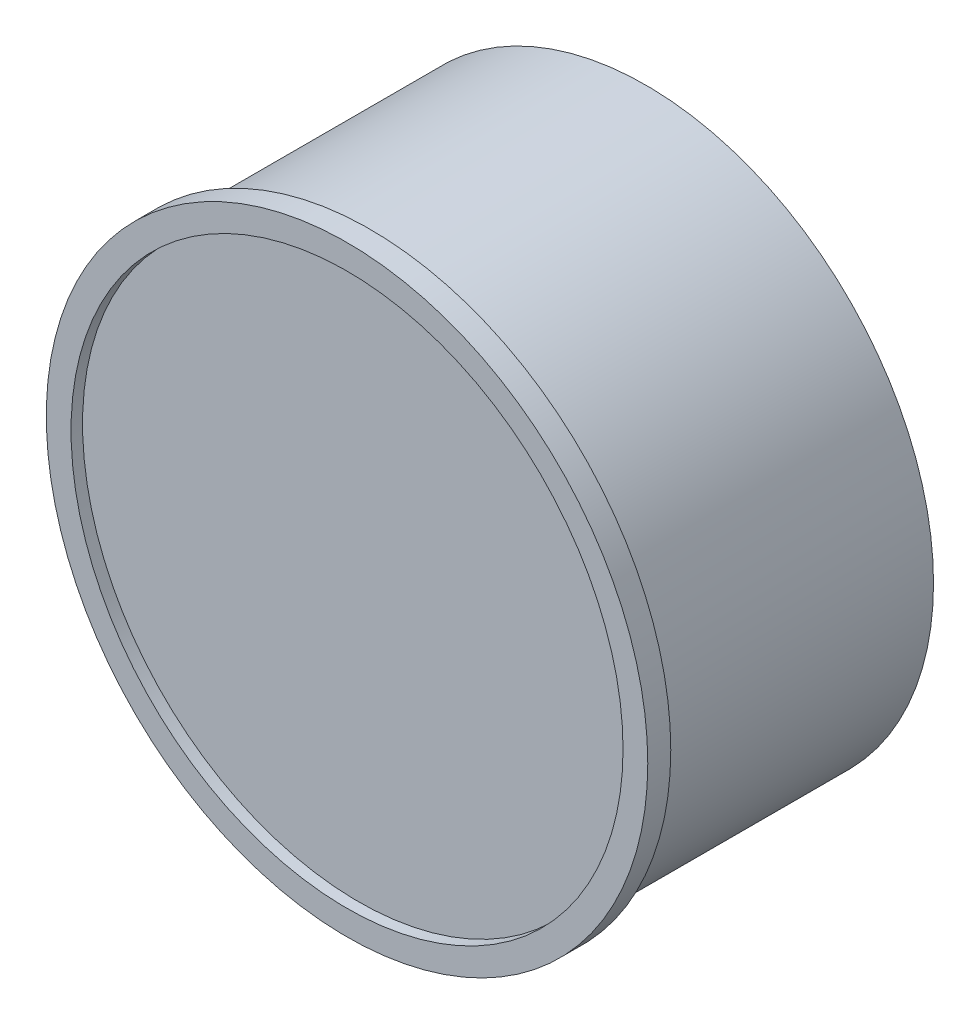
ISO-10303-21;
HEADER;
FILE_DESCRIPTION(('STEP AP214'),'2;1');
FILE_NAME('part.step','',(''),(''),'','','');
FILE_SCHEMA(('AUTOMOTIVE_DESIGN { 1 0 10303 214 1 1 1 1 }'));
ENDSEC;
DATA;
#1=APPLICATION_CONTEXT('core data for automotive mechanical design processes');
#2=APPLICATION_PROTOCOL_DEFINITION('international standard','automotive_design',2000,#1);
#3=PRODUCT_CONTEXT('',#1,'mechanical');
#4=PRODUCT('Part','Part','',(#3));
#5=PRODUCT_RELATED_PRODUCT_CATEGORY('part','',(#4));
#6=PRODUCT_DEFINITION_FORMATION('','',#4);
#7=PRODUCT_DEFINITION_CONTEXT('part definition',#1,'design');
#8=PRODUCT_DEFINITION('design','',#6,#7);
#9=PRODUCT_DEFINITION_SHAPE('','',#8);
#10=(LENGTH_UNIT() NAMED_UNIT(*) SI_UNIT(.MILLI.,.METRE.));
#11=(NAMED_UNIT(*) PLANE_ANGLE_UNIT() SI_UNIT($,.RADIAN.));
#12=(NAMED_UNIT(*) SI_UNIT($,.STERADIAN.) SOLID_ANGLE_UNIT());
#13=UNCERTAINTY_MEASURE_WITH_UNIT(LENGTH_MEASURE(1.E-05),#10,'distance_accuracy_value','');
#14=(GEOMETRIC_REPRESENTATION_CONTEXT(3) GLOBAL_UNCERTAINTY_ASSIGNED_CONTEXT((#13)) GLOBAL_UNIT_ASSIGNED_CONTEXT((#10,
#11,#12)) REPRESENTATION_CONTEXT('',''));
#15=CARTESIAN_POINT('',(0.,0.,0.));
#16=DIRECTION('',(0.,0.,1.));
#17=DIRECTION('',(1.,0.,0.));
#18=AXIS2_PLACEMENT_3D('',#15,#16,#17);
#19=CARTESIAN_POINT('',(0.,0.,0.));
#20=DIRECTION('',(0.,0.,1.));
#21=DIRECTION('',(1.,0.,0.));
#22=AXIS2_PLACEMENT_3D('',#19,#20,#21);
#23=PLANE('',#22);
#24=CARTESIAN_POINT('',(0.,0.,0.));
#25=DIRECTION('',(0.,0.,1.));
#26=DIRECTION('',(1.,0.,0.));
#27=AXIS2_PLACEMENT_3D('',#24,#25,#26);
#28=CIRCLE('',#27,41.5163);
#29=CARTESIAN_POINT('',(41.5163,0.,0.));
#30=VERTEX_POINT('',#29);
#31=EDGE_CURVE('E46',#30,#30,#28,.T.);
#32=ORIENTED_EDGE('',*,*,#31,.F.);
#33=EDGE_LOOP('',(#32));
#34=FACE_BOUND('',#33,.T.);
#35=CARTESIAN_POINT('',(0.,0.,0.));
#36=DIRECTION('',(0.,0.,1.));
#37=DIRECTION('',(1.,0.,0.));
#38=AXIS2_PLACEMENT_3D('',#35,#36,#37);
#39=CIRCLE('',#38,39.6875);
#40=CARTESIAN_POINT('',(39.6875,0.,0.));
#41=VERTEX_POINT('',#40);
#42=EDGE_CURVE('E10',#41,#41,#39,.F.);
#43=ORIENTED_EDGE('',*,*,#42,.F.);
#44=EDGE_LOOP('',(#43));
#45=FACE_BOUND('',#44,.T.);
#46=ADVANCED_FACE('F35',(#34,#45),#23,.F.);
#47=CARTESIAN_POINT('',(0.,0.,3.175));
#48=DIRECTION('',(0.,0.,-1.));
#49=DIRECTION('',(-1.,0.,0.));
#50=AXIS2_PLACEMENT_3D('',#47,#48,#49);
#51=CYLINDRICAL_SURFACE('',#50,41.5163);
#52=CARTESIAN_POINT('',(0.,0.,3.175));
#53=DIRECTION('',(0.,0.,1.));
#54=DIRECTION('',(1.,0.,0.));
#55=AXIS2_PLACEMENT_3D('',#52,#53,#54);
#56=CIRCLE('',#55,41.5163);
#57=CARTESIAN_POINT('',(41.5163,0.,3.175));
#58=VERTEX_POINT('',#57);
#59=EDGE_CURVE('E42',#58,#58,#56,.T.);
#60=ORIENTED_EDGE('',*,*,#59,.F.);
#61=EDGE_LOOP('',(#60));
#62=FACE_BOUND('',#61,.T.);
#63=ORIENTED_EDGE('',*,*,#31,.T.);
#64=EDGE_LOOP('',(#63));
#65=FACE_BOUND('',#64,.T.);
#66=ADVANCED_FACE('F37',(#62,#65),#51,.T.);
#67=CARTESIAN_POINT('',(0.,0.,3.175));
#68=DIRECTION('',(0.,0.,1.));
#69=DIRECTION('',(1.,0.,0.));
#70=AXIS2_PLACEMENT_3D('',#67,#68,#69);
#71=PLANE('',#70);
#72=CARTESIAN_POINT('',(0.,0.,3.175));
#73=DIRECTION('',(0.,0.,1.));
#74=DIRECTION('',(1.,0.,0.));
#75=AXIS2_PLACEMENT_3D('',#72,#73,#74);
#76=CIRCLE('',#75,38.1);
#77=CARTESIAN_POINT('',(38.1,0.,3.175));
#78=VERTEX_POINT('',#77);
#79=EDGE_CURVE('E56',#78,#78,#76,.T.);
#80=ORIENTED_EDGE('',*,*,#79,.F.);
#81=EDGE_LOOP('',(#80));
#82=FACE_BOUND('',#81,.T.);
#83=ORIENTED_EDGE('',*,*,#59,.T.);
#84=EDGE_LOOP('',(#83));
#85=FACE_BOUND('',#84,.T.);
#86=ADVANCED_FACE('F71',(#82,#85),#71,.T.);
#87=CARTESIAN_POINT('',(0.,0.,-38.1));
#88=DIRECTION('',(0.,0.,1.));
#89=DIRECTION('',(1.,0.,0.));
#90=AXIS2_PLACEMENT_3D('',#87,#88,#89);
#91=CYLINDRICAL_SURFACE('',#90,39.6875);
#92=CARTESIAN_POINT('',(0.,0.,-38.1));
#93=DIRECTION('',(0.,0.,-1.));
#94=DIRECTION('',(-1.,0.,0.));
#95=AXIS2_PLACEMENT_3D('',#92,#93,#94);
#96=CIRCLE('',#95,39.6875);
#97=CARTESIAN_POINT('',(39.6875,0.,-38.1));
#98=VERTEX_POINT('',#97);
#99=EDGE_CURVE('E51',#98,#98,#96,.T.);
#100=CARTESIAN_POINT('',(39.6875,0.,-38.1));
#101=CARTESIAN_POINT('',(39.6875,0.,-37.703125));
#102=CARTESIAN_POINT('',(39.6875,0.,-37.30625));
#103=CARTESIAN_POINT('',(39.6875,0.,-36.5125));
#104=CARTESIAN_POINT('',(39.6875,0.,-36.115625));
#105=CARTESIAN_POINT('',(39.6875,0.,-35.321875));
#106=CARTESIAN_POINT('',(39.6875,0.,-34.925));
#107=CARTESIAN_POINT('',(39.6875,0.,-34.13125));
#108=CARTESIAN_POINT('',(39.6875,0.,-33.734375));
#109=CARTESIAN_POINT('',(39.6875,0.,-32.940625));
#110=CARTESIAN_POINT('',(39.6875,0.,-32.54375));
#111=CARTESIAN_POINT('',(39.6875,0.,-31.75));
#112=CARTESIAN_POINT('',(39.6875,0.,-31.353125));
#113=CARTESIAN_POINT('',(39.6875,0.,-30.559375));
#114=CARTESIAN_POINT('',(39.6875,0.,-30.1625));
#115=CARTESIAN_POINT('',(39.6875,0.,-29.36875));
#116=CARTESIAN_POINT('',(39.6875,0.,-28.971875));
#117=CARTESIAN_POINT('',(39.6875,0.,-28.178125));
#118=CARTESIAN_POINT('',(39.6875,0.,-27.78125));
#119=CARTESIAN_POINT('',(39.6875,0.,-26.9875));
#120=CARTESIAN_POINT('',(39.6875,0.,-26.590625));
#121=CARTESIAN_POINT('',(39.6875,0.,-25.796875));
#122=CARTESIAN_POINT('',(39.6875,0.,-25.4));
#123=CARTESIAN_POINT('',(39.6875,0.,-24.60625));
#124=CARTESIAN_POINT('',(39.6875,0.,-24.209375));
#125=CARTESIAN_POINT('',(39.6875,0.,-23.415625));
#126=CARTESIAN_POINT('',(39.6875,0.,-23.01875));
#127=CARTESIAN_POINT('',(39.6875,0.,-22.225));
#128=CARTESIAN_POINT('',(39.6875,0.,-21.828125));
#129=CARTESIAN_POINT('',(39.6875,0.,-21.034375));
#130=CARTESIAN_POINT('',(39.6875,0.,-20.6375));
#131=CARTESIAN_POINT('',(39.6875,0.,-19.84375));
#132=CARTESIAN_POINT('',(39.6875,0.,-19.446875));
#133=CARTESIAN_POINT('',(39.6875,0.,-18.653125));
#134=CARTESIAN_POINT('',(39.6875,0.,-18.25625));
#135=CARTESIAN_POINT('',(39.6875,0.,-17.4625));
#136=CARTESIAN_POINT('',(39.6875,0.,-17.065625));
#137=CARTESIAN_POINT('',(39.6875,0.,-16.271875));
#138=CARTESIAN_POINT('',(39.6875,0.,-15.875));
#139=CARTESIAN_POINT('',(39.6875,0.,-15.08125));
#140=CARTESIAN_POINT('',(39.6875,0.,-14.684375));
#141=CARTESIAN_POINT('',(39.6875,0.,-13.890625));
#142=CARTESIAN_POINT('',(39.6875,0.,-13.49375));
#143=CARTESIAN_POINT('',(39.6875,0.,-12.7));
#144=CARTESIAN_POINT('',(39.6875,0.,-12.303125));
#145=CARTESIAN_POINT('',(39.6875,0.,-11.509375));
#146=CARTESIAN_POINT('',(39.6875,0.,-11.1125));
#147=CARTESIAN_POINT('',(39.6875,0.,-10.31875));
#148=CARTESIAN_POINT('',(39.6875,0.,-9.921875));
#149=CARTESIAN_POINT('',(39.6875,0.,-9.128125));
#150=CARTESIAN_POINT('',(39.6875,0.,-8.73125));
#151=CARTESIAN_POINT('',(39.6875,0.,-7.9375));
#152=CARTESIAN_POINT('',(39.6875,0.,-7.540625));
#153=CARTESIAN_POINT('',(39.6875,0.,-6.746875));
#154=CARTESIAN_POINT('',(39.6875,0.,-6.35));
#155=CARTESIAN_POINT('',(39.6875,0.,-5.55625));
#156=CARTESIAN_POINT('',(39.6875,0.,-5.159375));
#157=CARTESIAN_POINT('',(39.6875,0.,-4.365625));
#158=CARTESIAN_POINT('',(39.6875,0.,-3.96875));
#159=CARTESIAN_POINT('',(39.6875,0.,-3.175));
#160=CARTESIAN_POINT('',(39.6875,0.,-2.778125));
#161=CARTESIAN_POINT('',(39.6875,0.,-1.984375));
#162=CARTESIAN_POINT('',(39.6875,0.,-1.5875));
#163=CARTESIAN_POINT('',(39.6875,0.,-0.79375));
#164=CARTESIAN_POINT('',(39.6875,0.,-0.396875));
#165=CARTESIAN_POINT('',(39.6875,0.,0.));
#166=B_SPLINE_CURVE_WITH_KNOTS('',3,(#100,#101,#102,#103,#104,#105,#106,#107,#108,#109,#110,
#111,#112,#113,#114,#115,#116,#117,#118,#119,#120,#121,#122,#123,#124,#125,#126,#127,#128,#129,
#130,#131,#132,#133,#134,#135,#136,#137,#138,#139,#140,#141,#142,#143,#144,#145,#146,#147,#148,
#149,#150,#151,#152,#153,#154,#155,#156,#157,#158,#159,#160,#161,#162,#163,#164,#165),
.UNSPECIFIED.,.F.,.F.,(4,2,2,2,2,2,2,2,2,2,2,2,2,2,2,2,2,2,2,2,2,2,2,2,2,2,2,2,2,2,2,2,4),(0.,
1.19062499999999,2.38124999999999,3.571875,4.7625,5.953125,7.14375,8.33437499999999,9.525,
10.715625,11.90625,13.096875,14.2875,15.478125,16.66875,17.859375,19.05,20.240625,21.43125,
22.621875,23.8125,25.003125,26.19375,27.384375,28.575,29.765625,30.95625,32.146875,33.3375,
34.528125,35.71875,36.909375,38.1),.UNSPECIFIED.);
#167=EDGE_CURVE('BSEAM73',#98,#41,#166,.T.);
#168=ORIENTED_EDGE('',*,*,#99,.F.);
#169=ORIENTED_EDGE('',*,*,#42,.T.);
#170=ORIENTED_EDGE('',*,*,#167,.T.);
#171=ORIENTED_EDGE('',*,*,#167,.F.);
#172=EDGE_LOOP('',(#168,#170,#169,#171));
#173=FACE_BOUND('',#172,.T.);
#174=ADVANCED_FACE('F73',(#173),#91,.T.);
#175=CARTESIAN_POINT('',(0.,0.,-38.1));
#176=DIRECTION('',(0.,0.,-1.));
#177=DIRECTION('',(-1.,0.,0.));
#178=AXIS2_PLACEMENT_3D('',#175,#176,#177);
#179=PLANE('',#178);
#180=ORIENTED_EDGE('',*,*,#99,.T.);
#181=EDGE_LOOP('',(#180));
#182=FACE_BOUND('',#181,.T.);
#183=ADVANCED_FACE('F67',(#182),#179,.T.);
#184=CARTESIAN_POINT('',(0.,0.,1.5875));
#185=DIRECTION('',(0.,0.,1.));
#186=DIRECTION('',(1.,0.,0.));
#187=AXIS2_PLACEMENT_3D('',#184,#185,#186);
#188=CYLINDRICAL_SURFACE('',#187,38.1);
#189=CARTESIAN_POINT('',(0.,0.,1.5875));
#190=DIRECTION('',(0.,0.,1.));
#191=DIRECTION('',(1.,0.,0.));
#192=AXIS2_PLACEMENT_3D('',#189,#190,#191);
#193=CIRCLE('',#192,38.1);
#194=CARTESIAN_POINT('',(38.1,0.,1.5875));
#195=VERTEX_POINT('',#194);
#196=EDGE_CURVE('E55',#195,#195,#193,.T.);
#197=ORIENTED_EDGE('',*,*,#196,.F.);
#198=EDGE_LOOP('',(#197));
#199=FACE_BOUND('',#198,.T.);
#200=ORIENTED_EDGE('',*,*,#79,.T.);
#201=EDGE_LOOP('',(#200));
#202=FACE_BOUND('',#201,.T.);
#203=ADVANCED_FACE('F64',(#199,#202),#188,.F.);
#204=CARTESIAN_POINT('',(0.,0.,1.5875));
#205=DIRECTION('',(0.,0.,1.));
#206=DIRECTION('',(1.,0.,0.));
#207=AXIS2_PLACEMENT_3D('',#204,#205,#206);
#208=PLANE('',#207);
#209=ORIENTED_EDGE('',*,*,#196,.T.);
#210=EDGE_LOOP('',(#209));
#211=FACE_BOUND('',#210,.T.);
#212=ADVANCED_FACE('F62',(#211),#208,.T.);
#213=CLOSED_SHELL('',(#46,#66,#86,#174,#183,#203,#212));
#214=MANIFOLD_SOLID_BREP('B2',#213);
#215=ADVANCED_BREP_SHAPE_REPRESENTATION('',(#18,#214),#14);
#216=SHAPE_DEFINITION_REPRESENTATION(#9,#215);
ENDSEC;
END-ISO-10303-21;
